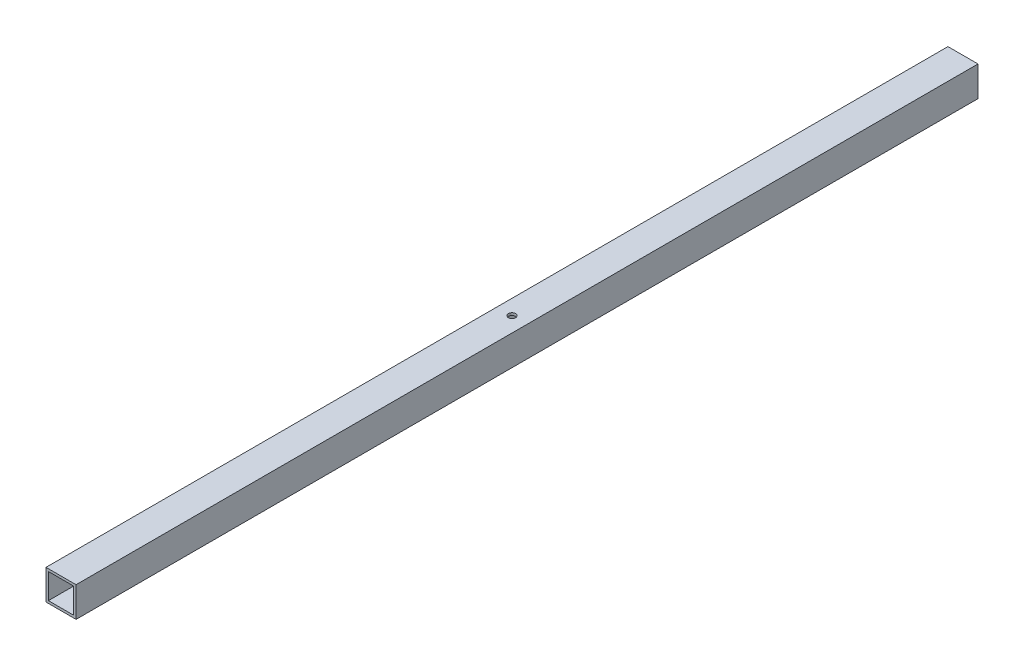
ISO-10303-21;
HEADER;
FILE_DESCRIPTION(('STEP AP214'),'2;1');
FILE_NAME('part.step','',(''),(''),'','','');
FILE_SCHEMA(('AUTOMOTIVE_DESIGN { 1 0 10303 214 1 1 1 1 }'));
ENDSEC;
DATA;
#1=APPLICATION_CONTEXT('core data for automotive mechanical design processes');
#2=APPLICATION_PROTOCOL_DEFINITION('international standard','automotive_design',2000,#1);
#3=PRODUCT_CONTEXT('',#1,'mechanical');
#4=PRODUCT('Part','Part','',(#3));
#5=PRODUCT_RELATED_PRODUCT_CATEGORY('part','',(#4));
#6=PRODUCT_DEFINITION_FORMATION('','',#4);
#7=PRODUCT_DEFINITION_CONTEXT('part definition',#1,'design');
#8=PRODUCT_DEFINITION('design','',#6,#7);
#9=PRODUCT_DEFINITION_SHAPE('','',#8);
#10=(LENGTH_UNIT() NAMED_UNIT(*) SI_UNIT(.MILLI.,.METRE.));
#11=(NAMED_UNIT(*) PLANE_ANGLE_UNIT() SI_UNIT($,.RADIAN.));
#12=(NAMED_UNIT(*) SI_UNIT($,.STERADIAN.) SOLID_ANGLE_UNIT());
#13=UNCERTAINTY_MEASURE_WITH_UNIT(LENGTH_MEASURE(1.E-05),#10,'distance_accuracy_value','');
#14=(GEOMETRIC_REPRESENTATION_CONTEXT(3) GLOBAL_UNCERTAINTY_ASSIGNED_CONTEXT((#13)) GLOBAL_UNIT_ASSIGNED_CONTEXT((#10,
#11,#12)) REPRESENTATION_CONTEXT('',''));
#15=CARTESIAN_POINT('',(0.,0.,0.));
#16=DIRECTION('',(0.,0.,1.));
#17=DIRECTION('',(1.,0.,0.));
#18=AXIS2_PLACEMENT_3D('',#15,#16,#17);
#19=CARTESIAN_POINT('',(0.,0.,750.));
#20=DIRECTION('',(0.,0.,-1.));
#21=DIRECTION('',(-1.,0.,0.));
#22=AXIS2_PLACEMENT_3D('',#19,#20,#21);
#23=PLANE('',#22);
#24=DIRECTION('',(0.,1.,0.));
#25=VECTOR('',#24,1.);
#26=CARTESIAN_POINT('',(25.,-25.,750.));
#27=LINE('',#26,#25);
#28=CARTESIAN_POINT('',(25.,-25.,750.));
#29=VERTEX_POINT('',#28);
#30=CARTESIAN_POINT('',(25.,25.,750.));
#31=VERTEX_POINT('',#30);
#32=EDGE_CURVE('E139',#29,#31,#27,.T.);
#33=ORIENTED_EDGE('',*,*,#32,.T.);
#34=DIRECTION('',(-1.,0.,0.));
#35=VECTOR('',#34,1.);
#36=CARTESIAN_POINT('',(-25.,25.,750.));
#37=LINE('',#36,#35);
#38=CARTESIAN_POINT('',(-25.,25.,750.));
#39=VERTEX_POINT('',#38);
#40=EDGE_CURVE('E142',#31,#39,#37,.T.);
#41=ORIENTED_EDGE('',*,*,#40,.T.);
#42=DIRECTION('',(0.,-1.,0.));
#43=VECTOR('',#42,1.);
#44=CARTESIAN_POINT('',(-25.,-25.,750.));
#45=LINE('',#44,#43);
#46=CARTESIAN_POINT('',(-25.,-25.,750.));
#47=VERTEX_POINT('',#46);
#48=EDGE_CURVE('E145',#39,#47,#45,.T.);
#49=ORIENTED_EDGE('',*,*,#48,.T.);
#50=DIRECTION('',(1.,0.,0.));
#51=VECTOR('',#50,1.);
#52=CARTESIAN_POINT('',(-25.,-25.,750.));
#53=LINE('',#52,#51);
#54=EDGE_CURVE('E147',#47,#29,#53,.T.);
#55=ORIENTED_EDGE('',*,*,#54,.T.);
#56=EDGE_LOOP('',(#33,#41,#49,#55));
#57=FACE_BOUND('',#56,.T.);
#58=DIRECTION('',(0.,-1.,0.));
#59=VECTOR('',#58,1.);
#60=CARTESIAN_POINT('',(-21.,-21.,750.));
#61=LINE('',#60,#59);
#62=CARTESIAN_POINT('',(-21.,21.,750.));
#63=VERTEX_POINT('',#62);
#64=CARTESIAN_POINT('',(-21.,-21.,750.));
#65=VERTEX_POINT('',#64);
#66=EDGE_CURVE('E101',#63,#65,#61,.T.);
#67=ORIENTED_EDGE('',*,*,#66,.F.);
#68=DIRECTION('',(-1.,0.,0.));
#69=VECTOR('',#68,1.);
#70=CARTESIAN_POINT('',(-21.,21.,750.));
#71=LINE('',#70,#69);
#72=CARTESIAN_POINT('',(21.,21.,750.));
#73=VERTEX_POINT('',#72);
#74=EDGE_CURVE('E123',#73,#63,#71,.T.);
#75=ORIENTED_EDGE('',*,*,#74,.F.);
#76=DIRECTION('',(0.,1.,0.));
#77=VECTOR('',#76,1.);
#78=CARTESIAN_POINT('',(21.,-21.,750.));
#79=LINE('',#78,#77);
#80=CARTESIAN_POINT('',(21.,-21.,750.));
#81=VERTEX_POINT('',#80);
#82=EDGE_CURVE('E121',#81,#73,#79,.T.);
#83=ORIENTED_EDGE('',*,*,#82,.F.);
#84=DIRECTION('',(1.,0.,0.));
#85=VECTOR('',#84,1.);
#86=CARTESIAN_POINT('',(-21.,-21.,750.));
#87=LINE('',#86,#85);
#88=EDGE_CURVE('E109',#65,#81,#87,.T.);
#89=ORIENTED_EDGE('',*,*,#88,.F.);
#90=EDGE_LOOP('',(#67,#75,#83,#89));
#91=FACE_BOUND('',#90,.T.);
#92=ADVANCED_FACE('F35',(#57,#91),#23,.F.);
#93=CARTESIAN_POINT('',(0.,0.,-750.));
#94=DIRECTION('',(0.,0.,-1.));
#95=DIRECTION('',(-1.,0.,0.));
#96=AXIS2_PLACEMENT_3D('',#93,#94,#95);
#97=PLANE('',#96);
#98=DIRECTION('',(0.,1.,0.));
#99=VECTOR('',#98,1.);
#100=CARTESIAN_POINT('',(25.,-25.,-750.));
#101=LINE('',#100,#99);
#102=CARTESIAN_POINT('',(25.,-25.,-750.));
#103=VERTEX_POINT('',#102);
#104=CARTESIAN_POINT('',(25.,25.,-750.));
#105=VERTEX_POINT('',#104);
#106=EDGE_CURVE('E117',#103,#105,#101,.T.);
#107=ORIENTED_EDGE('',*,*,#106,.F.);
#108=DIRECTION('',(1.,0.,0.));
#109=VECTOR('',#108,1.);
#110=CARTESIAN_POINT('',(-25.,-25.,-750.));
#111=LINE('',#110,#109);
#112=CARTESIAN_POINT('',(-25.,-25.,-750.));
#113=VERTEX_POINT('',#112);
#114=EDGE_CURVE('E143',#113,#103,#111,.T.);
#115=ORIENTED_EDGE('',*,*,#114,.F.);
#116=DIRECTION('',(0.,-1.,0.));
#117=VECTOR('',#116,1.);
#118=CARTESIAN_POINT('',(-25.,-25.,-750.));
#119=LINE('',#118,#117);
#120=CARTESIAN_POINT('',(-25.,25.,-750.));
#121=VERTEX_POINT('',#120);
#122=EDGE_CURVE('E154',#121,#113,#119,.T.);
#123=ORIENTED_EDGE('',*,*,#122,.F.);
#124=DIRECTION('',(-1.,0.,0.));
#125=VECTOR('',#124,1.);
#126=CARTESIAN_POINT('',(-25.,25.,-750.));
#127=LINE('',#126,#125);
#128=EDGE_CURVE('E152',#105,#121,#127,.T.);
#129=ORIENTED_EDGE('',*,*,#128,.F.);
#130=EDGE_LOOP('',(#107,#115,#123,#129));
#131=FACE_BOUND('',#130,.T.);
#132=DIRECTION('',(-1.,0.,0.));
#133=VECTOR('',#132,1.);
#134=CARTESIAN_POINT('',(-21.,21.,-750.));
#135=LINE('',#134,#133);
#136=CARTESIAN_POINT('',(21.,21.,-750.));
#137=VERTEX_POINT('',#136);
#138=CARTESIAN_POINT('',(-21.,21.,-750.));
#139=VERTEX_POINT('',#138);
#140=EDGE_CURVE('E110',#137,#139,#135,.T.);
#141=ORIENTED_EDGE('',*,*,#140,.T.);
#142=DIRECTION('',(0.,-1.,0.));
#143=VECTOR('',#142,1.);
#144=CARTESIAN_POINT('',(-21.,-21.,-750.));
#145=LINE('',#144,#143);
#146=CARTESIAN_POINT('',(-21.,-21.,-750.));
#147=VERTEX_POINT('',#146);
#148=EDGE_CURVE('E59',#139,#147,#145,.T.);
#149=ORIENTED_EDGE('',*,*,#148,.T.);
#150=DIRECTION('',(1.,0.,0.));
#151=VECTOR('',#150,1.);
#152=CARTESIAN_POINT('',(-21.,-21.,-750.));
#153=LINE('',#152,#151);
#154=CARTESIAN_POINT('',(21.,-21.,-750.));
#155=VERTEX_POINT('',#154);
#156=EDGE_CURVE('E116',#147,#155,#153,.T.);
#157=ORIENTED_EDGE('',*,*,#156,.T.);
#158=DIRECTION('',(0.,1.,0.));
#159=VECTOR('',#158,1.);
#160=CARTESIAN_POINT('',(21.,-21.,-750.));
#161=LINE('',#160,#159);
#162=EDGE_CURVE('E131',#155,#137,#161,.T.);
#163=ORIENTED_EDGE('',*,*,#162,.T.);
#164=EDGE_LOOP('',(#141,#149,#157,#163));
#165=FACE_BOUND('',#164,.T.);
#166=ADVANCED_FACE('F173',(#131,#165),#97,.T.);
#167=CARTESIAN_POINT('',(25.,-25.,750.));
#168=DIRECTION('',(-1.,0.,0.));
#169=DIRECTION('',(0.,0.,1.));
#170=AXIS2_PLACEMENT_3D('',#167,#168,#169);
#171=PLANE('',#170);
#172=ORIENTED_EDGE('',*,*,#106,.T.);
#173=DIRECTION('',(0.,0.,-1.));
#174=VECTOR('',#173,1.);
#175=CARTESIAN_POINT('',(25.,25.,750.));
#176=LINE('',#175,#174);
#177=EDGE_CURVE('E11',#31,#105,#176,.T.);
#178=ORIENTED_EDGE('',*,*,#177,.F.);
#179=ORIENTED_EDGE('',*,*,#32,.F.);
#180=DIRECTION('',(0.,0.,-1.));
#181=VECTOR('',#180,1.);
#182=CARTESIAN_POINT('',(25.,-25.,750.));
#183=LINE('',#182,#181);
#184=EDGE_CURVE('E149',#29,#103,#183,.T.);
#185=ORIENTED_EDGE('',*,*,#184,.T.);
#186=EDGE_LOOP('',(#172,#178,#179,#185));
#187=FACE_BOUND('',#186,.T.);
#188=ADVANCED_FACE('F37',(#187),#171,.F.);
#189=CARTESIAN_POINT('',(-25.,25.,750.));
#190=DIRECTION('',(0.,-1.,0.));
#191=DIRECTION('',(0.,0.,-1.));
#192=AXIS2_PLACEMENT_3D('',#189,#190,#191);
#193=PLANE('',#192);
#194=CARTESIAN_POINT('',(0.,25.,0.));
#195=DIRECTION('',(0.,1.,0.));
#196=DIRECTION('',(0.,0.,1.));
#197=AXIS2_PLACEMENT_3D('',#194,#195,#196);
#198=CIRCLE('',#197,6.);
#199=CARTESIAN_POINT('',(0.,25.,6.));
#200=VERTEX_POINT('',#199);
#201=EDGE_CURVE('E212',#200,#200,#198,.T.);
#202=ORIENTED_EDGE('',*,*,#201,.F.);
#203=EDGE_LOOP('',(#202));
#204=FACE_BOUND('',#203,.T.);
#205=ORIENTED_EDGE('',*,*,#128,.T.);
#206=DIRECTION('',(0.,0.,-1.));
#207=VECTOR('',#206,1.);
#208=CARTESIAN_POINT('',(-25.,25.,750.));
#209=LINE('',#208,#207);
#210=EDGE_CURVE('E44',#39,#121,#209,.T.);
#211=ORIENTED_EDGE('',*,*,#210,.F.);
#212=ORIENTED_EDGE('',*,*,#40,.F.);
#213=ORIENTED_EDGE('',*,*,#177,.T.);
#214=EDGE_LOOP('',(#205,#211,#212,#213));
#215=FACE_BOUND('',#214,.T.);
#216=ADVANCED_FACE('F183',(#204,#215),#193,.F.);
#217=CARTESIAN_POINT('',(-25.,-25.,750.));
#218=DIRECTION('',(1.,0.,0.));
#219=DIRECTION('',(0.,0.,-1.));
#220=AXIS2_PLACEMENT_3D('',#217,#218,#219);
#221=PLANE('',#220);
#222=ORIENTED_EDGE('',*,*,#122,.T.);
#223=DIRECTION('',(0.,0.,-1.));
#224=VECTOR('',#223,1.);
#225=CARTESIAN_POINT('',(-25.,-25.,750.));
#226=LINE('',#225,#224);
#227=EDGE_CURVE('E159',#47,#113,#226,.T.);
#228=ORIENTED_EDGE('',*,*,#227,.F.);
#229=ORIENTED_EDGE('',*,*,#48,.F.);
#230=ORIENTED_EDGE('',*,*,#210,.T.);
#231=EDGE_LOOP('',(#222,#228,#229,#230));
#232=FACE_BOUND('',#231,.T.);
#233=ADVANCED_FACE('F167',(#232),#221,.F.);
#234=CARTESIAN_POINT('',(-25.,-25.,750.));
#235=DIRECTION('',(0.,1.,0.));
#236=DIRECTION('',(0.,0.,1.));
#237=AXIS2_PLACEMENT_3D('',#234,#235,#236);
#238=PLANE('',#237);
#239=CARTESIAN_POINT('',(0.,-25.,0.));
#240=DIRECTION('',(0.,1.,0.));
#241=DIRECTION('',(0.,0.,1.));
#242=AXIS2_PLACEMENT_3D('',#239,#240,#241);
#243=CIRCLE('',#242,6.);
#244=CARTESIAN_POINT('',(0.,-25.,6.));
#245=VERTEX_POINT('',#244);
#246=EDGE_CURVE('E210',#245,#245,#243,.T.);
#247=ORIENTED_EDGE('',*,*,#246,.T.);
#248=EDGE_LOOP('',(#247));
#249=FACE_BOUND('',#248,.T.);
#250=ORIENTED_EDGE('',*,*,#114,.T.);
#251=ORIENTED_EDGE('',*,*,#184,.F.);
#252=ORIENTED_EDGE('',*,*,#54,.F.);
#253=ORIENTED_EDGE('',*,*,#227,.T.);
#254=EDGE_LOOP('',(#250,#251,#252,#253));
#255=FACE_BOUND('',#254,.T.);
#256=ADVANCED_FACE('F177',(#249,#255),#238,.F.);
#257=CARTESIAN_POINT('',(-21.,-21.,750.));
#258=DIRECTION('',(1.,0.,0.));
#259=DIRECTION('',(0.,0.,-1.));
#260=AXIS2_PLACEMENT_3D('',#257,#258,#259);
#261=PLANE('',#260);
#262=ORIENTED_EDGE('',*,*,#148,.F.);
#263=DIRECTION('',(0.,0.,-1.));
#264=VECTOR('',#263,1.);
#265=CARTESIAN_POINT('',(-21.,21.,750.));
#266=LINE('',#265,#264);
#267=EDGE_CURVE('E105',#63,#139,#266,.T.);
#268=ORIENTED_EDGE('',*,*,#267,.F.);
#269=ORIENTED_EDGE('',*,*,#66,.T.);
#270=DIRECTION('',(0.,0.,-1.));
#271=VECTOR('',#270,1.);
#272=CARTESIAN_POINT('',(-21.,-21.,750.));
#273=LINE('',#272,#271);
#274=EDGE_CURVE('E104',#65,#147,#273,.T.);
#275=ORIENTED_EDGE('',*,*,#274,.T.);
#276=EDGE_LOOP('',(#262,#268,#269,#275));
#277=FACE_BOUND('',#276,.T.);
#278=ADVANCED_FACE('F103',(#277),#261,.T.);
#279=CARTESIAN_POINT('',(-21.,-21.,750.));
#280=DIRECTION('',(0.,1.,0.));
#281=DIRECTION('',(0.,0.,1.));
#282=AXIS2_PLACEMENT_3D('',#279,#280,#281);
#283=PLANE('',#282);
#284=CARTESIAN_POINT('',(0.,-21.,0.));
#285=DIRECTION('',(0.,1.,0.));
#286=DIRECTION('',(0.,0.,1.));
#287=AXIS2_PLACEMENT_3D('',#284,#285,#286);
#288=CIRCLE('',#287,6.);
#289=CARTESIAN_POINT('',(0.,-21.,6.));
#290=VERTEX_POINT('',#289);
#291=EDGE_CURVE('E129',#290,#290,#288,.T.);
#292=ORIENTED_EDGE('',*,*,#291,.F.);
#293=EDGE_LOOP('',(#292));
#294=FACE_BOUND('',#293,.T.);
#295=ORIENTED_EDGE('',*,*,#156,.F.);
#296=ORIENTED_EDGE('',*,*,#274,.F.);
#297=ORIENTED_EDGE('',*,*,#88,.T.);
#298=DIRECTION('',(0.,0.,-1.));
#299=VECTOR('',#298,1.);
#300=CARTESIAN_POINT('',(21.,-21.,750.));
#301=LINE('',#300,#299);
#302=EDGE_CURVE('E118',#81,#155,#301,.T.);
#303=ORIENTED_EDGE('',*,*,#302,.T.);
#304=EDGE_LOOP('',(#295,#296,#297,#303));
#305=FACE_BOUND('',#304,.T.);
#306=ADVANCED_FACE('F113',(#294,#305),#283,.T.);
#307=CARTESIAN_POINT('',(21.,-21.,750.));
#308=DIRECTION('',(-1.,0.,0.));
#309=DIRECTION('',(0.,-1.,0.));
#310=AXIS2_PLACEMENT_3D('',#307,#308,#309);
#311=PLANE('',#310);
#312=ORIENTED_EDGE('',*,*,#162,.F.);
#313=ORIENTED_EDGE('',*,*,#302,.F.);
#314=ORIENTED_EDGE('',*,*,#82,.T.);
#315=DIRECTION('',(0.,0.,-1.));
#316=VECTOR('',#315,1.);
#317=CARTESIAN_POINT('',(21.,21.,750.));
#318=LINE('',#317,#316);
#319=EDGE_CURVE('E51',#73,#137,#318,.T.);
#320=ORIENTED_EDGE('',*,*,#319,.T.);
#321=EDGE_LOOP('',(#312,#313,#314,#320));
#322=FACE_BOUND('',#321,.T.);
#323=ADVANCED_FACE('F222',(#322),#311,.T.);
#324=CARTESIAN_POINT('',(-21.,21.,750.));
#325=DIRECTION('',(0.,-1.,0.));
#326=DIRECTION('',(0.,0.,-1.));
#327=AXIS2_PLACEMENT_3D('',#324,#325,#326);
#328=PLANE('',#327);
#329=CARTESIAN_POINT('',(0.,21.,0.));
#330=DIRECTION('',(0.,-1.,0.));
#331=DIRECTION('',(0.,0.,-1.));
#332=AXIS2_PLACEMENT_3D('',#329,#330,#331);
#333=CIRCLE('',#332,6.);
#334=CARTESIAN_POINT('',(0.,21.,-6.));
#335=VERTEX_POINT('',#334);
#336=EDGE_CURVE('E39',#335,#335,#333,.T.);
#337=ORIENTED_EDGE('',*,*,#336,.F.);
#338=EDGE_LOOP('',(#337));
#339=FACE_BOUND('',#338,.T.);
#340=ORIENTED_EDGE('',*,*,#140,.F.);
#341=ORIENTED_EDGE('',*,*,#319,.F.);
#342=ORIENTED_EDGE('',*,*,#74,.T.);
#343=ORIENTED_EDGE('',*,*,#267,.T.);
#344=EDGE_LOOP('',(#340,#341,#342,#343));
#345=FACE_BOUND('',#344,.T.);
#346=ADVANCED_FACE('F227',(#339,#345),#328,.T.);
#347=CARTESIAN_POINT('',(0.,-25.,0.));
#348=DIRECTION('',(0.,1.,0.));
#349=DIRECTION('',(0.,0.,1.));
#350=AXIS2_PLACEMENT_3D('',#347,#348,#349);
#351=CYLINDRICAL_SURFACE('',#350,6.);
#352=ORIENTED_EDGE('',*,*,#336,.T.);
#353=EDGE_LOOP('',(#352));
#354=FACE_BOUND('',#353,.T.);
#355=ORIENTED_EDGE('',*,*,#201,.T.);
#356=EDGE_LOOP('',(#355));
#357=FACE_BOUND('',#356,.T.);
#358=ADVANCED_FACE('F232',(#354,#357),#351,.F.);
#359=ORIENTED_EDGE('',*,*,#291,.T.);
#360=EDGE_LOOP('',(#359));
#361=FACE_BOUND('',#360,.T.);
#362=ORIENTED_EDGE('',*,*,#246,.F.);
#363=EDGE_LOOP('',(#362));
#364=FACE_BOUND('',#363,.T.);
#365=ADVANCED_FACE('F220',(#361,#364),#351,.F.);
#366=CLOSED_SHELL('',(#92,#166,#188,#216,#233,#256,#278,#306,#323,#346,#358,#365));
#367=MANIFOLD_SOLID_BREP('B2',#366);
#368=ADVANCED_BREP_SHAPE_REPRESENTATION('',(#18,#367),#14);
#369=SHAPE_DEFINITION_REPRESENTATION(#9,#368);
ENDSEC;
END-ISO-10303-21;
